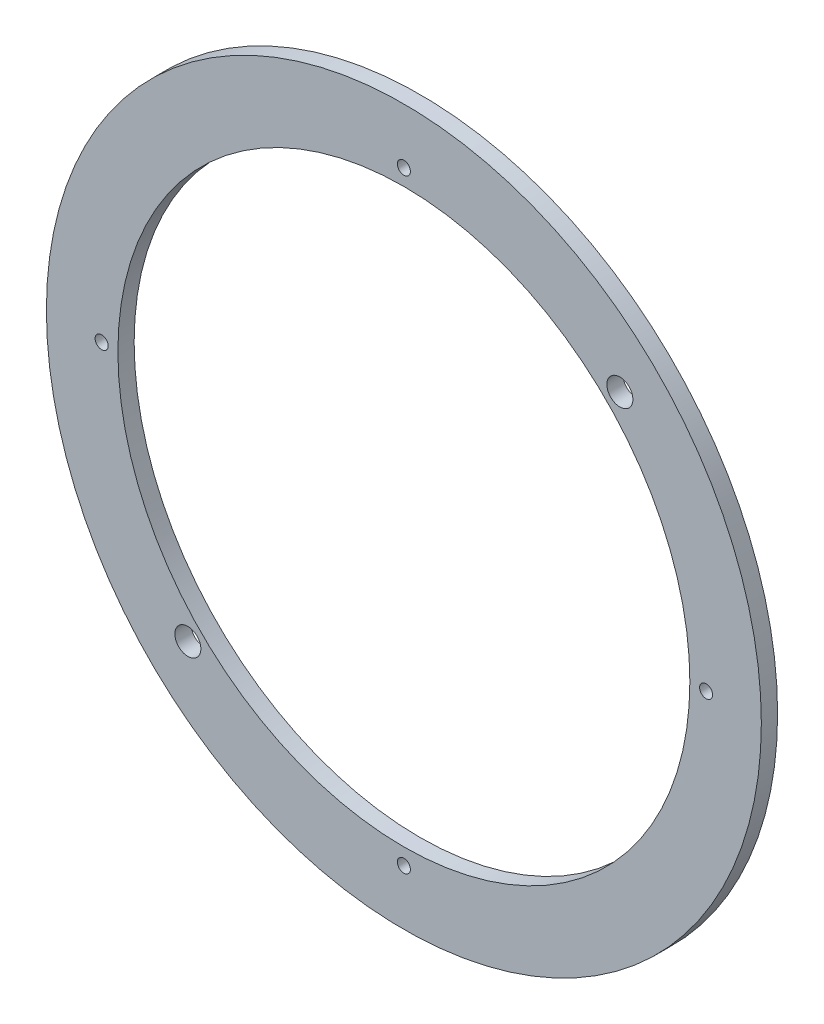
ISO-10303-21;
HEADER;
FILE_DESCRIPTION(('STEP AP214'),'2;1');
FILE_NAME('part.step','',(''),(''),'','','');
FILE_SCHEMA(('AUTOMOTIVE_DESIGN { 1 0 10303 214 1 1 1 1 }'));
ENDSEC;
DATA;
#1=APPLICATION_CONTEXT('core data for automotive mechanical design processes');
#2=APPLICATION_PROTOCOL_DEFINITION('international standard','automotive_design',2000,#1);
#3=PRODUCT_CONTEXT('',#1,'mechanical');
#4=PRODUCT('Part','Part','',(#3));
#5=PRODUCT_RELATED_PRODUCT_CATEGORY('part','',(#4));
#6=PRODUCT_DEFINITION_FORMATION('','',#4);
#7=PRODUCT_DEFINITION_CONTEXT('part definition',#1,'design');
#8=PRODUCT_DEFINITION('design','',#6,#7);
#9=PRODUCT_DEFINITION_SHAPE('','',#8);
#10=(LENGTH_UNIT() NAMED_UNIT(*) SI_UNIT(.MILLI.,.METRE.));
#11=(NAMED_UNIT(*) PLANE_ANGLE_UNIT() SI_UNIT($,.RADIAN.));
#12=(NAMED_UNIT(*) SI_UNIT($,.STERADIAN.) SOLID_ANGLE_UNIT());
#13=UNCERTAINTY_MEASURE_WITH_UNIT(LENGTH_MEASURE(1.E-05),#10,'distance_accuracy_value','');
#14=(GEOMETRIC_REPRESENTATION_CONTEXT(3) GLOBAL_UNCERTAINTY_ASSIGNED_CONTEXT((#13)) GLOBAL_UNIT_ASSIGNED_CONTEXT((#10,
#11,#12)) REPRESENTATION_CONTEXT('',''));
#15=CARTESIAN_POINT('',(0.,0.,0.));
#16=DIRECTION('',(0.,0.,1.));
#17=DIRECTION('',(1.,0.,0.));
#18=AXIS2_PLACEMENT_3D('',#15,#16,#17);
#19=CARTESIAN_POINT('',(-8.54872034122459,-3.36544415628814,3.175));
#20=DIRECTION('',(0.,0.,-1.));
#21=DIRECTION('',(-1.,0.,0.));
#22=AXIS2_PLACEMENT_3D('',#19,#20,#21);
#23=CYLINDRICAL_SURFACE('',#22,55.88);
#24=CARTESIAN_POINT('',(-8.54872034122459,-3.36544415628814,3.175));
#25=DIRECTION('',(0.,0.,1.));
#26=DIRECTION('',(1.,0.,0.));
#27=AXIS2_PLACEMENT_3D('',#24,#25,#26);
#28=CIRCLE('',#27,55.88);
#29=CARTESIAN_POINT('',(47.3312796587754,-3.36544415628814,3.175));
#30=VERTEX_POINT('',#29);
#31=EDGE_CURVE('E40',#30,#30,#28,.T.);
#32=ORIENTED_EDGE('',*,*,#31,.T.);
#33=EDGE_LOOP('',(#32));
#34=FACE_BOUND('',#33,.T.);
#35=CARTESIAN_POINT('',(-8.54872034122459,-3.36544415628814,0.));
#36=DIRECTION('',(0.,0.,1.));
#37=DIRECTION('',(1.,0.,0.));
#38=AXIS2_PLACEMENT_3D('',#35,#36,#37);
#39=CIRCLE('',#38,55.88);
#40=CARTESIAN_POINT('',(47.3312796587754,-3.36544415628814,0.));
#41=VERTEX_POINT('',#40);
#42=EDGE_CURVE('E47',#41,#41,#39,.T.);
#43=ORIENTED_EDGE('',*,*,#42,.F.);
#44=EDGE_LOOP('',(#43));
#45=FACE_BOUND('',#44,.T.);
#46=ADVANCED_FACE('F33',(#34,#45),#23,.F.);
#47=CARTESIAN_POINT('',(-8.54872034122459,-3.36544415628814,3.175));
#48=DIRECTION('',(0.,0.,-1.));
#49=DIRECTION('',(-1.,0.,0.));
#50=AXIS2_PLACEMENT_3D('',#47,#48,#49);
#51=CYLINDRICAL_SURFACE('',#50,69.85);
#52=CARTESIAN_POINT('',(-8.54872034122459,-3.36544415628814,3.175));
#53=DIRECTION('',(0.,0.,1.));
#54=DIRECTION('',(1.,0.,0.));
#55=AXIS2_PLACEMENT_3D('',#52,#53,#54);
#56=CIRCLE('',#55,69.85);
#57=CARTESIAN_POINT('',(61.3012796587754,-3.36544415628814,3.175));
#58=VERTEX_POINT('',#57);
#59=EDGE_CURVE('E10',#58,#58,#56,.T.);
#60=ORIENTED_EDGE('',*,*,#59,.F.);
#61=EDGE_LOOP('',(#60));
#62=FACE_BOUND('',#61,.T.);
#63=CARTESIAN_POINT('',(-8.54872034122459,-3.36544415628814,0.));
#64=DIRECTION('',(0.,0.,1.));
#65=DIRECTION('',(1.,0.,0.));
#66=AXIS2_PLACEMENT_3D('',#63,#64,#65);
#67=CIRCLE('',#66,69.85);
#68=CARTESIAN_POINT('',(61.3012796587754,-3.36544415628814,0.));
#69=VERTEX_POINT('',#68);
#70=EDGE_CURVE('E36',#69,#69,#67,.T.);
#71=ORIENTED_EDGE('',*,*,#70,.T.);
#72=EDGE_LOOP('',(#71));
#73=FACE_BOUND('',#72,.T.);
#74=ADVANCED_FACE('F118',(#62,#73),#51,.T.);
#75=CARTESIAN_POINT('',(0.,0.,3.175));
#76=DIRECTION('',(0.,0.,1.));
#77=DIRECTION('',(1.,0.,0.));
#78=AXIS2_PLACEMENT_3D('',#75,#76,#77);
#79=PLANE('',#78);
#80=CARTESIAN_POINT('',(-50.7559241102495,-45.5726479253132,3.175));
#81=DIRECTION('',(0.,0.,-1.));
#82=DIRECTION('',(-1.,0.,0.));
#83=AXIS2_PLACEMENT_3D('',#80,#81,#82);
#84=CIRCLE('',#83,2.54);
#85=CARTESIAN_POINT('',(-53.2959241102495,-45.5726479253132,3.175));
#86=VERTEX_POINT('',#85);
#87=EDGE_CURVE('E82',#86,#86,#84,.T.);
#88=ORIENTED_EDGE('',*,*,#87,.T.);
#89=EDGE_LOOP('',(#88));
#90=FACE_BOUND('',#89,.T.);
#91=CARTESIAN_POINT('',(33.6584834278002,38.8417596127371,3.175));
#92=DIRECTION('',(0.,0.,-1.));
#93=DIRECTION('',(-1.,0.,0.));
#94=AXIS2_PLACEMENT_3D('',#91,#92,#93);
#95=CIRCLE('',#94,2.54);
#96=CARTESIAN_POINT('',(31.1184834278002,38.8417596127371,3.175));
#97=VERTEX_POINT('',#96);
#98=EDGE_CURVE('E76',#97,#97,#95,.T.);
#99=ORIENTED_EDGE('',*,*,#98,.T.);
#100=EDGE_LOOP('',(#99));
#101=FACE_BOUND('',#100,.T.);
#102=CARTESIAN_POINT('',(-67.6037203412246,-3.36544415628814,3.175));
#103=DIRECTION('',(0.,0.,-1.));
#104=DIRECTION('',(-1.,0.,0.));
#105=AXIS2_PLACEMENT_3D('',#102,#103,#104);
#106=CIRCLE('',#105,1.26999999999999);
#107=CARTESIAN_POINT('',(-68.8737203412246,-3.36544415628814,3.175));
#108=VERTEX_POINT('',#107);
#109=EDGE_CURVE('E70',#108,#108,#106,.T.);
#110=ORIENTED_EDGE('',*,*,#109,.T.);
#111=EDGE_LOOP('',(#110));
#112=FACE_BOUND('',#111,.T.);
#113=CARTESIAN_POINT('',(-8.5487203412246,-62.4204441562881,3.175));
#114=DIRECTION('',(0.,0.,-1.));
#115=DIRECTION('',(-1.,0.,0.));
#116=AXIS2_PLACEMENT_3D('',#113,#114,#115);
#117=CIRCLE('',#116,1.27);
#118=CARTESIAN_POINT('',(-9.8187203412246,-62.4204441562881,3.175));
#119=VERTEX_POINT('',#118);
#120=EDGE_CURVE('E64',#119,#119,#117,.T.);
#121=ORIENTED_EDGE('',*,*,#120,.T.);
#122=EDGE_LOOP('',(#121));
#123=FACE_BOUND('',#122,.T.);
#124=CARTESIAN_POINT('',(50.5062796587754,-3.36544415628814,3.175));
#125=DIRECTION('',(0.,0.,-1.));
#126=DIRECTION('',(-1.,0.,0.));
#127=AXIS2_PLACEMENT_3D('',#124,#125,#126);
#128=CIRCLE('',#127,1.27);
#129=CARTESIAN_POINT('',(49.2362796587754,-3.36544415628814,3.175));
#130=VERTEX_POINT('',#129);
#131=EDGE_CURVE('E59',#130,#130,#128,.T.);
#132=ORIENTED_EDGE('',*,*,#131,.T.);
#133=EDGE_LOOP('',(#132));
#134=FACE_BOUND('',#133,.T.);
#135=CARTESIAN_POINT('',(-8.5487203412246,55.6895558437119,3.175));
#136=DIRECTION('',(0.,0.,-1.));
#137=DIRECTION('',(-1.,0.,0.));
#138=AXIS2_PLACEMENT_3D('',#135,#136,#137);
#139=CIRCLE('',#138,1.27);
#140=CARTESIAN_POINT('',(-9.8187203412246,55.6895558437119,3.175));
#141=VERTEX_POINT('',#140);
#142=EDGE_CURVE('E49',#141,#141,#139,.T.);
#143=ORIENTED_EDGE('',*,*,#142,.T.);
#144=EDGE_LOOP('',(#143));
#145=FACE_BOUND('',#144,.T.);
#146=ORIENTED_EDGE('',*,*,#31,.F.);
#147=EDGE_LOOP('',(#146));
#148=FACE_BOUND('',#147,.T.);
#149=ORIENTED_EDGE('',*,*,#59,.T.);
#150=EDGE_LOOP('',(#149));
#151=FACE_BOUND('',#150,.T.);
#152=ADVANCED_FACE('F91',(#90,#101,#112,#123,#134,#145,#148,#151),#79,.T.);
#153=CARTESIAN_POINT('',(0.,0.,0.));
#154=DIRECTION('',(0.,0.,1.));
#155=DIRECTION('',(1.,0.,0.));
#156=AXIS2_PLACEMENT_3D('',#153,#154,#155);
#157=PLANE('',#156);
#158=CARTESIAN_POINT('',(-50.7559241102495,-45.5726479253132,0.));
#159=DIRECTION('',(0.,0.,-1.));
#160=DIRECTION('',(-1.,0.,0.));
#161=AXIS2_PLACEMENT_3D('',#158,#159,#160);
#162=CIRCLE('',#161,2.54);
#163=CARTESIAN_POINT('',(-53.2959241102495,-45.5726479253132,0.));
#164=VERTEX_POINT('',#163);
#165=EDGE_CURVE('E85',#164,#164,#162,.T.);
#166=ORIENTED_EDGE('',*,*,#165,.F.);
#167=EDGE_LOOP('',(#166));
#168=FACE_BOUND('',#167,.T.);
#169=CARTESIAN_POINT('',(33.6584834278002,38.8417596127371,0.));
#170=DIRECTION('',(0.,0.,-1.));
#171=DIRECTION('',(-1.,0.,0.));
#172=AXIS2_PLACEMENT_3D('',#169,#170,#171);
#173=CIRCLE('',#172,2.54);
#174=CARTESIAN_POINT('',(31.1184834278002,38.8417596127371,0.));
#175=VERTEX_POINT('',#174);
#176=EDGE_CURVE('E79',#175,#175,#173,.T.);
#177=ORIENTED_EDGE('',*,*,#176,.F.);
#178=EDGE_LOOP('',(#177));
#179=FACE_BOUND('',#178,.T.);
#180=CARTESIAN_POINT('',(-67.6037203412246,-3.36544415628814,0.));
#181=DIRECTION('',(0.,0.,-1.));
#182=DIRECTION('',(-1.,0.,0.));
#183=AXIS2_PLACEMENT_3D('',#180,#181,#182);
#184=CIRCLE('',#183,1.26999999999999);
#185=CARTESIAN_POINT('',(-68.8737203412246,-3.36544415628814,0.));
#186=VERTEX_POINT('',#185);
#187=EDGE_CURVE('E73',#186,#186,#184,.T.);
#188=ORIENTED_EDGE('',*,*,#187,.F.);
#189=EDGE_LOOP('',(#188));
#190=FACE_BOUND('',#189,.T.);
#191=CARTESIAN_POINT('',(-8.5487203412246,-62.4204441562881,0.));
#192=DIRECTION('',(0.,0.,-1.));
#193=DIRECTION('',(-1.,0.,0.));
#194=AXIS2_PLACEMENT_3D('',#191,#192,#193);
#195=CIRCLE('',#194,1.27);
#196=CARTESIAN_POINT('',(-9.8187203412246,-62.4204441562881,0.));
#197=VERTEX_POINT('',#196);
#198=EDGE_CURVE('E67',#197,#197,#195,.T.);
#199=ORIENTED_EDGE('',*,*,#198,.F.);
#200=EDGE_LOOP('',(#199));
#201=FACE_BOUND('',#200,.T.);
#202=CARTESIAN_POINT('',(50.5062796587754,-3.36544415628814,0.));
#203=DIRECTION('',(0.,0.,-1.));
#204=DIRECTION('',(-1.,0.,0.));
#205=AXIS2_PLACEMENT_3D('',#202,#203,#204);
#206=CIRCLE('',#205,1.27);
#207=CARTESIAN_POINT('',(49.2362796587754,-3.36544415628814,0.));
#208=VERTEX_POINT('',#207);
#209=EDGE_CURVE('E61',#208,#208,#206,.T.);
#210=ORIENTED_EDGE('',*,*,#209,.F.);
#211=EDGE_LOOP('',(#210));
#212=FACE_BOUND('',#211,.T.);
#213=CARTESIAN_POINT('',(-8.5487203412246,55.6895558437119,0.));
#214=DIRECTION('',(0.,0.,-1.));
#215=DIRECTION('',(-1.,0.,0.));
#216=AXIS2_PLACEMENT_3D('',#213,#214,#215);
#217=CIRCLE('',#216,1.27);
#218=CARTESIAN_POINT('',(-9.8187203412246,55.6895558437119,0.));
#219=VERTEX_POINT('',#218);
#220=EDGE_CURVE('E54',#219,#219,#217,.T.);
#221=ORIENTED_EDGE('',*,*,#220,.F.);
#222=EDGE_LOOP('',(#221));
#223=FACE_BOUND('',#222,.T.);
#224=ORIENTED_EDGE('',*,*,#42,.T.);
#225=EDGE_LOOP('',(#224));
#226=FACE_BOUND('',#225,.T.);
#227=ORIENTED_EDGE('',*,*,#70,.F.);
#228=EDGE_LOOP('',(#227));
#229=FACE_BOUND('',#228,.T.);
#230=ADVANCED_FACE('F101',(#168,#179,#190,#201,#212,#223,#226,#229),#157,.F.);
#231=CARTESIAN_POINT('',(-8.5487203412246,55.6895558437119,3.175));
#232=DIRECTION('',(0.,0.,-1.));
#233=DIRECTION('',(-1.,0.,0.));
#234=AXIS2_PLACEMENT_3D('',#231,#232,#233);
#235=CYLINDRICAL_SURFACE('',#234,1.27);
#236=ORIENTED_EDGE('',*,*,#142,.F.);
#237=EDGE_LOOP('',(#236));
#238=FACE_BOUND('',#237,.T.);
#239=ORIENTED_EDGE('',*,*,#220,.T.);
#240=EDGE_LOOP('',(#239));
#241=FACE_BOUND('',#240,.T.);
#242=ADVANCED_FACE('F104',(#238,#241),#235,.F.);
#243=CARTESIAN_POINT('',(50.5062796587754,-3.36544415628814,3.175));
#244=DIRECTION('',(0.,0.,-1.));
#245=DIRECTION('',(-1.,0.,0.));
#246=AXIS2_PLACEMENT_3D('',#243,#244,#245);
#247=CYLINDRICAL_SURFACE('',#246,1.27);
#248=ORIENTED_EDGE('',*,*,#131,.F.);
#249=EDGE_LOOP('',(#248));
#250=FACE_BOUND('',#249,.T.);
#251=ORIENTED_EDGE('',*,*,#209,.T.);
#252=EDGE_LOOP('',(#251));
#253=FACE_BOUND('',#252,.T.);
#254=ADVANCED_FACE('F130',(#250,#253),#247,.F.);
#255=CARTESIAN_POINT('',(-8.5487203412246,-62.4204441562881,3.175));
#256=DIRECTION('',(0.,0.,-1.));
#257=DIRECTION('',(-1.,0.,0.));
#258=AXIS2_PLACEMENT_3D('',#255,#256,#257);
#259=CYLINDRICAL_SURFACE('',#258,1.27);
#260=ORIENTED_EDGE('',*,*,#120,.F.);
#261=EDGE_LOOP('',(#260));
#262=FACE_BOUND('',#261,.T.);
#263=ORIENTED_EDGE('',*,*,#198,.T.);
#264=EDGE_LOOP('',(#263));
#265=FACE_BOUND('',#264,.T.);
#266=ADVANCED_FACE('F134',(#262,#265),#259,.F.);
#267=CARTESIAN_POINT('',(-67.6037203412246,-3.36544415628814,3.175));
#268=DIRECTION('',(0.,0.,-1.));
#269=DIRECTION('',(-1.,0.,0.));
#270=AXIS2_PLACEMENT_3D('',#267,#268,#269);
#271=CYLINDRICAL_SURFACE('',#270,1.26999999999999);
#272=ORIENTED_EDGE('',*,*,#109,.F.);
#273=EDGE_LOOP('',(#272));
#274=FACE_BOUND('',#273,.T.);
#275=ORIENTED_EDGE('',*,*,#187,.T.);
#276=EDGE_LOOP('',(#275));
#277=FACE_BOUND('',#276,.T.);
#278=ADVANCED_FACE('F138',(#274,#277),#271,.F.);
#279=CARTESIAN_POINT('',(33.6584834278002,38.8417596127371,3.175));
#280=DIRECTION('',(0.,0.,-1.));
#281=DIRECTION('',(-1.,0.,0.));
#282=AXIS2_PLACEMENT_3D('',#279,#280,#281);
#283=CYLINDRICAL_SURFACE('',#282,2.54);
#284=ORIENTED_EDGE('',*,*,#98,.F.);
#285=EDGE_LOOP('',(#284));
#286=FACE_BOUND('',#285,.T.);
#287=ORIENTED_EDGE('',*,*,#176,.T.);
#288=EDGE_LOOP('',(#287));
#289=FACE_BOUND('',#288,.T.);
#290=ADVANCED_FACE('F97',(#286,#289),#283,.F.);
#291=CARTESIAN_POINT('',(-50.7559241102495,-45.5726479253132,3.175));
#292=DIRECTION('',(0.,0.,-1.));
#293=DIRECTION('',(-1.,0.,0.));
#294=AXIS2_PLACEMENT_3D('',#291,#292,#293);
#295=CYLINDRICAL_SURFACE('',#294,2.54);
#296=ORIENTED_EDGE('',*,*,#87,.F.);
#297=EDGE_LOOP('',(#296));
#298=FACE_BOUND('',#297,.T.);
#299=ORIENTED_EDGE('',*,*,#165,.T.);
#300=EDGE_LOOP('',(#299));
#301=FACE_BOUND('',#300,.T.);
#302=ADVANCED_FACE('F94',(#298,#301),#295,.F.);
#303=CLOSED_SHELL('',(#46,#74,#152,#230,#242,#254,#266,#278,#290,#302));
#304=MANIFOLD_SOLID_BREP('B2',#303);
#305=ADVANCED_BREP_SHAPE_REPRESENTATION('',(#18,#304),#14);
#306=SHAPE_DEFINITION_REPRESENTATION(#9,#305);
ENDSEC;
END-ISO-10303-21;
